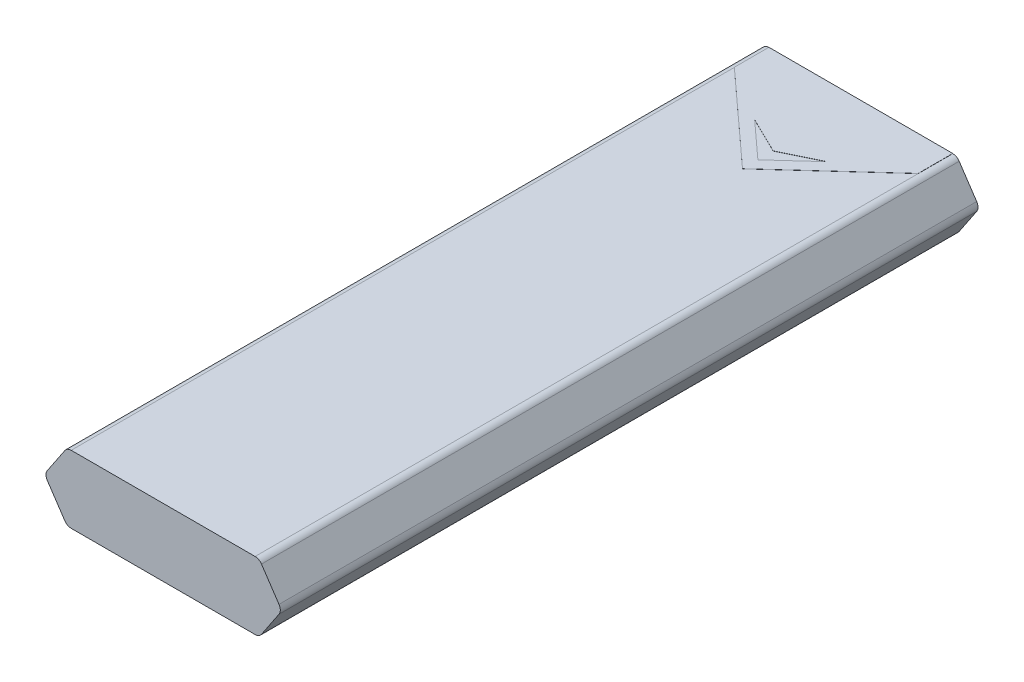
ISO-10303-21;
HEADER;
FILE_DESCRIPTION(('STEP AP214'),'2;1');
FILE_NAME('part.step','',(''),(''),'','','');
FILE_SCHEMA(('AUTOMOTIVE_DESIGN { 1 0 10303 214 1 1 1 1 }'));
ENDSEC;
DATA;
#1=APPLICATION_CONTEXT('core data for automotive mechanical design processes');
#2=APPLICATION_PROTOCOL_DEFINITION('international standard','automotive_design',2000,#1);
#3=PRODUCT_CONTEXT('',#1,'mechanical');
#4=PRODUCT('Part','Part','',(#3));
#5=PRODUCT_RELATED_PRODUCT_CATEGORY('part','',(#4));
#6=PRODUCT_DEFINITION_FORMATION('','',#4);
#7=PRODUCT_DEFINITION_CONTEXT('part definition',#1,'design');
#8=PRODUCT_DEFINITION('design','',#6,#7);
#9=PRODUCT_DEFINITION_SHAPE('','',#8);
#10=(LENGTH_UNIT() NAMED_UNIT(*) SI_UNIT(.MILLI.,.METRE.));
#11=(NAMED_UNIT(*) PLANE_ANGLE_UNIT() SI_UNIT($,.RADIAN.));
#12=(NAMED_UNIT(*) SI_UNIT($,.STERADIAN.) SOLID_ANGLE_UNIT());
#13=UNCERTAINTY_MEASURE_WITH_UNIT(LENGTH_MEASURE(1.E-05),#10,'distance_accuracy_value','');
#14=(GEOMETRIC_REPRESENTATION_CONTEXT(3) GLOBAL_UNCERTAINTY_ASSIGNED_CONTEXT((#13)) GLOBAL_UNIT_ASSIGNED_CONTEXT((#10,
#11,#12)) REPRESENTATION_CONTEXT('',''));
#15=CARTESIAN_POINT('',(0.,0.,0.));
#16=DIRECTION('',(0.,0.,1.));
#17=DIRECTION('',(1.,0.,0.));
#18=AXIS2_PLACEMENT_3D('',#15,#16,#17);
#19=CARTESIAN_POINT('',(0.,5.6134,0.));
#20=DIRECTION('',(0.,-1.,0.));
#21=DIRECTION('',(0.,0.,-1.));
#22=AXIS2_PLACEMENT_3D('',#19,#20,#21);
#23=PLANE('',#22);
#24=DIRECTION('',(-0.739282758629296,0.,0.673395131251673));
#25=VECTOR('',#24,1.);
#26=CARTESIAN_POINT('',(15.1974535495722,5.6134,5.715));
#27=LINE('',#26,#25);
#28=CARTESIAN_POINT('',(15.1974535495722,5.6134,5.715));
#29=VERTEX_POINT('',#28);
#30=CARTESIAN_POINT('',(0.,5.6134,19.558));
#31=VERTEX_POINT('',#30);
#32=EDGE_CURVE('E308',#29,#31,#27,.T.);
#33=ORIENTED_EDGE('',*,*,#32,.F.);
#34=DIRECTION('',(0.,0.,1.));
#35=VECTOR('',#34,1.);
#36=CARTESIAN_POINT('',(15.1974535495722,5.6134,0.));
#37=LINE('',#36,#35);
#38=CARTESIAN_POINT('',(15.1974535495722,5.6134,0.));
#39=VERTEX_POINT('',#38);
#40=EDGE_CURVE('E323',#39,#29,#37,.T.);
#41=ORIENTED_EDGE('',*,*,#40,.F.);
#42=DIRECTION('',(-1.,0.,0.));
#43=VECTOR('',#42,1.);
#44=CARTESIAN_POINT('',(15.1974535495722,5.6134,0.));
#45=LINE('',#44,#43);
#46=CARTESIAN_POINT('',(-15.1974535495722,5.6134,0.));
#47=VERTEX_POINT('',#46);
#48=EDGE_CURVE('E320',#39,#47,#45,.T.);
#49=ORIENTED_EDGE('',*,*,#48,.T.);
#50=DIRECTION('',(0.,0.,1.));
#51=VECTOR('',#50,1.);
#52=CARTESIAN_POINT('',(-15.1974535495722,5.6134,0.));
#53=LINE('',#52,#51);
#54=CARTESIAN_POINT('',(-15.1974535495722,5.6134,5.715));
#55=VERTEX_POINT('',#54);
#56=EDGE_CURVE('E317',#47,#55,#53,.T.);
#57=ORIENTED_EDGE('',*,*,#56,.T.);
#58=DIRECTION('',(-0.739282758629296,0.,-0.673395131251672));
#59=VECTOR('',#58,1.);
#60=CARTESIAN_POINT('',(0.,5.6134,19.558));
#61=LINE('',#60,#59);
#62=EDGE_CURVE('E312',#31,#55,#61,.T.);
#63=ORIENTED_EDGE('',*,*,#62,.F.);
#64=EDGE_LOOP('',(#33,#41,#49,#57,#63));
#65=FACE_BOUND('',#64,.T.);
#66=DIRECTION('',(-0.739282758629296,0.,0.673395131251673));
#67=VECTOR('',#66,1.);
#68=CARTESIAN_POINT('',(6.00952982800082,5.6134,11.5440618078114));
#69=LINE('',#68,#67);
#70=CARTESIAN_POINT('',(6.00952982800082,5.6134,11.5440618078114));
#71=VERTEX_POINT('',#70);
#72=CARTESIAN_POINT('',(0.,5.6134,17.018));
#73=VERTEX_POINT('',#72);
#74=EDGE_CURVE('E61',#71,#73,#69,.T.);
#75=ORIENTED_EDGE('',*,*,#74,.T.);
#76=DIRECTION('',(-0.739282758629297,0.,-0.673395131251672));
#77=VECTOR('',#76,1.);
#78=CARTESIAN_POINT('',(0.,5.6134,17.018));
#79=LINE('',#78,#77);
#80=CARTESIAN_POINT('',(-6.00952982800082,5.6134,11.5440618078114));
#81=VERTEX_POINT('',#80);
#82=EDGE_CURVE('E252',#73,#81,#79,.T.);
#83=ORIENTED_EDGE('',*,*,#82,.T.);
#84=DIRECTION('',(0.898623434488135,0.,0.438720780210773));
#85=VECTOR('',#84,1.);
#86=CARTESIAN_POINT('',(-6.00952982800082,5.6134,11.5440618078114));
#87=LINE('',#86,#85);
#88=CARTESIAN_POINT('',(0.,5.6134,14.478));
#89=VERTEX_POINT('',#88);
#90=EDGE_CURVE('E835',#81,#89,#87,.T.);
#91=ORIENTED_EDGE('',*,*,#90,.T.);
#92=DIRECTION('',(0.898623434488135,0.,-0.438720780210773));
#93=VECTOR('',#92,1.);
#94=CARTESIAN_POINT('',(0.,5.6134,14.478));
#95=LINE('',#94,#93);
#96=EDGE_CURVE('E248',#89,#71,#95,.T.);
#97=ORIENTED_EDGE('',*,*,#96,.T.);
#98=EDGE_LOOP('',(#75,#83,#91,#97));
#99=FACE_BOUND('',#98,.T.);
#100=ADVANCED_FACE('F45',(#65,#99),#23,.F.);
#101=CARTESIAN_POINT('',(-15.875,-5.588,115.316));
#102=DIRECTION('',(0.,1.,0.));
#103=DIRECTION('',(0.,0.,1.));
#104=AXIS2_PLACEMENT_3D('',#101,#102,#103);
#105=PLANE('',#104);
#106=DIRECTION('',(-0.739282758629296,0.,0.673395131251673));
#107=VECTOR('',#106,1.);
#108=CARTESIAN_POINT('',(15.1974535495722,-5.588,5.715));
#109=LINE('',#108,#107);
#110=CARTESIAN_POINT('',(15.1974535495722,-5.588,5.71500000000003));
#111=VERTEX_POINT('',#110);
#112=CARTESIAN_POINT('',(0.,-5.588,19.558));
#113=VERTEX_POINT('',#112);
#114=EDGE_CURVE('E254',#111,#113,#109,.T.);
#115=ORIENTED_EDGE('',*,*,#114,.F.);
#116=DIRECTION('',(0.,0.,-1.));
#117=VECTOR('',#116,1.);
#118=CARTESIAN_POINT('',(15.1974535495722,-5.588,115.316));
#119=LINE('',#118,#117);
#120=CARTESIAN_POINT('',(15.1974535495722,-5.588,115.316));
#121=VERTEX_POINT('',#120);
#122=EDGE_CURVE('E500',#111,#121,#119,.F.);
#123=ORIENTED_EDGE('',*,*,#122,.T.);
#124=DIRECTION('',(1.,0.,0.));
#125=VECTOR('',#124,1.);
#126=CARTESIAN_POINT('',(-15.875,-5.588,115.316));
#127=LINE('',#126,#125);
#128=CARTESIAN_POINT('',(-15.1974535495722,-5.588,115.316));
#129=VERTEX_POINT('',#128);
#130=EDGE_CURVE('E408',#129,#121,#127,.T.);
#131=ORIENTED_EDGE('',*,*,#130,.F.);
#132=DIRECTION('',(0.,0.,-1.));
#133=VECTOR('',#132,1.);
#134=CARTESIAN_POINT('',(-15.1974535495722,-5.588,115.316));
#135=LINE('',#134,#133);
#136=CARTESIAN_POINT('',(-15.1974535495722,-5.588,5.715));
#137=VERTEX_POINT('',#136);
#138=EDGE_CURVE('E497',#129,#137,#135,.T.);
#139=ORIENTED_EDGE('',*,*,#138,.T.);
#140=DIRECTION('',(-0.739282758629296,0.,-0.673395131251672));
#141=VECTOR('',#140,1.);
#142=CARTESIAN_POINT('',(0.,-5.588,19.558));
#143=LINE('',#142,#141);
#144=EDGE_CURVE('E69',#113,#137,#143,.T.);
#145=ORIENTED_EDGE('',*,*,#144,.F.);
#146=EDGE_LOOP('',(#115,#123,#131,#139,#145));
#147=FACE_BOUND('',#146,.T.);
#148=ADVANCED_FACE('F543',(#147),#105,.F.);
#149=CARTESIAN_POINT('',(0.,0.,0.));
#150=DIRECTION('',(0.,0.,1.));
#151=DIRECTION('',(1.,0.,0.));
#152=AXIS2_PLACEMENT_3D('',#149,#150,#151);
#153=PLANE('',#152);
#154=CARTESIAN_POINT('',(-15.1974535495722,4.318,0.));
#155=DIRECTION('',(0.,0.,1.));
#156=DIRECTION('',(1.,0.,0.));
#157=AXIS2_PLACEMENT_3D('',#154,#155,#156);
#158=CIRCLE('',#157,1.27);
#159=CARTESIAN_POINT('',(-16.2523096486468,5.02523306642506,0.));
#160=VERTEX_POINT('',#159);
#161=CARTESIAN_POINT('',(-15.1974535495722,5.588,0.));
#162=VERTEX_POINT('',#161);
#163=EDGE_CURVE('E447',#160,#162,#158,.F.);
#164=ORIENTED_EDGE('',*,*,#163,.T.);
#165=DIRECTION('',(0.,-1.,0.));
#166=VECTOR('',#165,1.);
#167=CARTESIAN_POINT('',(-15.1974535495722,5.6134,0.));
#168=LINE('',#167,#166);
#169=EDGE_CURVE('E345',#47,#162,#168,.T.);
#170=ORIENTED_EDGE('',*,*,#169,.F.);
#171=ORIENTED_EDGE('',*,*,#48,.F.);
#172=DIRECTION('',(0.,-1.,0.));
#173=VECTOR('',#172,1.);
#174=CARTESIAN_POINT('',(15.1974535495722,5.6134,0.));
#175=LINE('',#174,#173);
#176=CARTESIAN_POINT('',(15.1974535495722,5.588,0.));
#177=VERTEX_POINT('',#176);
#178=EDGE_CURVE('E341',#39,#177,#175,.T.);
#179=ORIENTED_EDGE('',*,*,#178,.T.);
#180=CARTESIAN_POINT('',(15.1974535495722,4.318,0.));
#181=DIRECTION('',(0.,0.,1.));
#182=DIRECTION('',(1.,0.,0.));
#183=AXIS2_PLACEMENT_3D('',#180,#181,#182);
#184=CIRCLE('',#183,1.27);
#185=CARTESIAN_POINT('',(16.2523096486468,5.02523306642506,0.));
#186=VERTEX_POINT('',#185);
#187=EDGE_CURVE('E462',#177,#186,#184,.F.);
#188=ORIENTED_EDGE('',*,*,#187,.T.);
#189=DIRECTION('',(-0.55687643025595,0.830595353602095,0.));
#190=VECTOR('',#189,1.);
#191=CARTESIAN_POINT('',(19.6215,0.,0.));
#192=LINE('',#191,#190);
#193=CARTESIAN_POINT('',(19.1473323759196,0.707233066425055,0.));
#194=VERTEX_POINT('',#193);
#195=EDGE_CURVE('E404',#194,#186,#192,.T.);
#196=ORIENTED_EDGE('',*,*,#195,.F.);
#197=CARTESIAN_POINT('',(18.0924762768449,0.,0.));
#198=DIRECTION('',(0.,0.,1.));
#199=DIRECTION('',(1.,0.,0.));
#200=AXIS2_PLACEMENT_3D('',#197,#198,#199);
#201=CIRCLE('',#200,1.27);
#202=CARTESIAN_POINT('',(19.1473323759196,-0.707233066425056,0.));
#203=VERTEX_POINT('',#202);
#204=EDGE_CURVE('E459',#194,#203,#201,.F.);
#205=ORIENTED_EDGE('',*,*,#204,.T.);
#206=DIRECTION('',(0.55687643025595,0.830595353602095,0.));
#207=VECTOR('',#206,1.);
#208=CARTESIAN_POINT('',(15.875,-5.588,0.));
#209=LINE('',#208,#207);
#210=CARTESIAN_POINT('',(16.2523096486468,-5.02523306642506,0.));
#211=VERTEX_POINT('',#210);
#212=EDGE_CURVE('E432',#211,#203,#209,.T.);
#213=ORIENTED_EDGE('',*,*,#212,.F.);
#214=CARTESIAN_POINT('',(15.1974535495722,-4.318,0.));
#215=DIRECTION('',(0.,0.,1.));
#216=DIRECTION('',(1.,0.,0.));
#217=AXIS2_PLACEMENT_3D('',#214,#215,#216);
#218=CIRCLE('',#217,1.27);
#219=CARTESIAN_POINT('',(15.1974535495722,-5.588,0.));
#220=VERTEX_POINT('',#219);
#221=EDGE_CURVE('E456',#211,#220,#218,.F.);
#222=ORIENTED_EDGE('',*,*,#221,.T.);
#223=DIRECTION('',(0.,1.,0.));
#224=VECTOR('',#223,1.);
#225=CARTESIAN_POINT('',(15.1974535495722,-5.6134,0.));
#226=LINE('',#225,#224);
#227=CARTESIAN_POINT('',(15.1974535495722,-5.6134,0.));
#228=VERTEX_POINT('',#227);
#229=EDGE_CURVE('E301',#228,#220,#226,.T.);
#230=ORIENTED_EDGE('',*,*,#229,.F.);
#231=DIRECTION('',(-1.,0.,0.));
#232=VECTOR('',#231,1.);
#233=CARTESIAN_POINT('',(15.1974535495722,-5.6134,0.));
#234=LINE('',#233,#232);
#235=CARTESIAN_POINT('',(-15.1974535495722,-5.6134,0.));
#236=VERTEX_POINT('',#235);
#237=EDGE_CURVE('E273',#228,#236,#234,.T.);
#238=ORIENTED_EDGE('',*,*,#237,.T.);
#239=DIRECTION('',(0.,1.,0.));
#240=VECTOR('',#239,1.);
#241=CARTESIAN_POINT('',(-15.1974535495722,-5.6134,0.));
#242=LINE('',#241,#240);
#243=CARTESIAN_POINT('',(-15.1974535495722,-5.588,0.));
#244=VERTEX_POINT('',#243);
#245=EDGE_CURVE('E297',#236,#244,#242,.T.);
#246=ORIENTED_EDGE('',*,*,#245,.T.);
#247=CARTESIAN_POINT('',(-15.1974535495722,-4.318,0.));
#248=DIRECTION('',(0.,0.,1.));
#249=DIRECTION('',(1.,0.,0.));
#250=AXIS2_PLACEMENT_3D('',#247,#248,#249);
#251=CIRCLE('',#250,1.27);
#252=CARTESIAN_POINT('',(-16.2523096486468,-5.02523306642506,0.));
#253=VERTEX_POINT('',#252);
#254=EDGE_CURVE('E453',#244,#253,#251,.F.);
#255=ORIENTED_EDGE('',*,*,#254,.T.);
#256=DIRECTION('',(0.55687643025595,-0.830595353602095,0.));
#257=VECTOR('',#256,1.);
#258=CARTESIAN_POINT('',(-19.6215,0.,0.));
#259=LINE('',#258,#257);
#260=CARTESIAN_POINT('',(-19.1473323759196,-0.707233066425053,0.));
#261=VERTEX_POINT('',#260);
#262=EDGE_CURVE('E428',#261,#253,#259,.T.);
#263=ORIENTED_EDGE('',*,*,#262,.F.);
#264=CARTESIAN_POINT('',(-18.0924762768449,0.,0.));
#265=DIRECTION('',(0.,0.,1.));
#266=DIRECTION('',(1.,0.,0.));
#267=AXIS2_PLACEMENT_3D('',#264,#265,#266);
#268=CIRCLE('',#267,1.27);
#269=CARTESIAN_POINT('',(-19.1473323759196,0.707233066425055,0.));
#270=VERTEX_POINT('',#269);
#271=EDGE_CURVE('E450',#261,#270,#268,.F.);
#272=ORIENTED_EDGE('',*,*,#271,.T.);
#273=DIRECTION('',(-0.55687643025595,-0.830595353602095,0.));
#274=VECTOR('',#273,1.);
#275=CARTESIAN_POINT('',(-15.875,5.588,0.));
#276=LINE('',#275,#274);
#277=EDGE_CURVE('E395',#160,#270,#276,.T.);
#278=ORIENTED_EDGE('',*,*,#277,.F.);
#279=EDGE_LOOP('',(#164,#170,#171,#179,#188,#196,#205,#213,#222,#230,#238,#246,#255,#263,#272,#278));
#280=FACE_BOUND('',#279,.T.);
#281=DIRECTION('',(-1.,0.,0.));
#282=VECTOR('',#281,1.);
#283=CARTESIAN_POINT('',(2.9337,1.1938,0.));
#284=LINE('',#283,#282);
#285=CARTESIAN_POINT('',(2.9337,1.1938,0.));
#286=VERTEX_POINT('',#285);
#287=CARTESIAN_POINT('',(-2.9337,1.1938,0.));
#288=VERTEX_POINT('',#287);
#289=EDGE_CURVE('E360',#286,#288,#284,.T.);
#290=ORIENTED_EDGE('',*,*,#289,.T.);
#291=CARTESIAN_POINT('',(-2.9337,0.,0.));
#292=DIRECTION('',(0.,0.,1.));
#293=DIRECTION('',(1.,0.,0.));
#294=AXIS2_PLACEMENT_3D('',#291,#292,#293);
#295=CIRCLE('',#294,1.1938);
#296=CARTESIAN_POINT('',(-2.9337,-1.1938,0.));
#297=VERTEX_POINT('',#296);
#298=EDGE_CURVE('E373',#288,#297,#295,.T.);
#299=ORIENTED_EDGE('',*,*,#298,.T.);
#300=DIRECTION('',(-1.,0.,0.));
#301=VECTOR('',#300,1.);
#302=CARTESIAN_POINT('',(2.9337,-1.1938,0.));
#303=LINE('',#302,#301);
#304=CARTESIAN_POINT('',(2.9337,-1.1938,0.));
#305=VERTEX_POINT('',#304);
#306=EDGE_CURVE('E340',#305,#297,#303,.T.);
#307=ORIENTED_EDGE('',*,*,#306,.F.);
#308=CARTESIAN_POINT('',(2.9337,0.,0.));
#309=DIRECTION('',(0.,0.,-1.));
#310=DIRECTION('',(-1.,0.,0.));
#311=AXIS2_PLACEMENT_3D('',#308,#309,#310);
#312=CIRCLE('',#311,1.1938);
#313=EDGE_CURVE('E387',#286,#305,#312,.T.);
#314=ORIENTED_EDGE('',*,*,#313,.F.);
#315=EDGE_LOOP('',(#290,#299,#307,#314));
#316=FACE_BOUND('',#315,.T.);
#317=ADVANCED_FACE('F522',(#280,#316),#153,.F.);
#318=CARTESIAN_POINT('',(2.9337,0.,6.985));
#319=DIRECTION('',(0.,0.,-1.));
#320=DIRECTION('',(-1.,0.,0.));
#321=AXIS2_PLACEMENT_3D('',#318,#319,#320);
#322=CYLINDRICAL_SURFACE('',#321,1.1938);
#323=DIRECTION('',(0.,0.,-1.));
#324=VECTOR('',#323,1.);
#325=CARTESIAN_POINT('',(2.9337,1.1938,6.985));
#326=LINE('',#325,#324);
#327=CARTESIAN_POINT('',(2.9337,1.1938,6.985));
#328=VERTEX_POINT('',#327);
#329=EDGE_CURVE('E369',#328,#286,#326,.T.);
#330=ORIENTED_EDGE('',*,*,#329,.T.);
#331=ORIENTED_EDGE('',*,*,#313,.T.);
#332=DIRECTION('',(0.,0.,-1.));
#333=VECTOR('',#332,1.);
#334=CARTESIAN_POINT('',(2.9337,-1.1938,6.985));
#335=LINE('',#334,#333);
#336=CARTESIAN_POINT('',(2.9337,-1.1938,6.985));
#337=VERTEX_POINT('',#336);
#338=EDGE_CURVE('E363',#337,#305,#335,.T.);
#339=ORIENTED_EDGE('',*,*,#338,.F.);
#340=CARTESIAN_POINT('',(2.9337,0.,6.985));
#341=DIRECTION('',(0.,0.,-1.));
#342=DIRECTION('',(-1.,0.,0.));
#343=AXIS2_PLACEMENT_3D('',#340,#341,#342);
#344=CIRCLE('',#343,1.1938);
#345=EDGE_CURVE('E391',#328,#337,#344,.T.);
#346=ORIENTED_EDGE('',*,*,#345,.F.);
#347=EDGE_LOOP('',(#330,#331,#339,#346));
#348=FACE_BOUND('',#347,.T.);
#349=ADVANCED_FACE('F644',(#348),#322,.F.);
#350=CARTESIAN_POINT('',(-2.9337,0.,6.985));
#351=DIRECTION('',(0.,0.,-1.));
#352=DIRECTION('',(-1.,0.,0.));
#353=AXIS2_PLACEMENT_3D('',#350,#351,#352);
#354=CYLINDRICAL_SURFACE('',#353,1.1938);
#355=ORIENTED_EDGE('',*,*,#298,.F.);
#356=DIRECTION('',(0.,0.,-1.));
#357=VECTOR('',#356,1.);
#358=CARTESIAN_POINT('',(-2.9337,1.1938,6.985));
#359=LINE('',#358,#357);
#360=CARTESIAN_POINT('',(-2.9337,1.1938,6.985));
#361=VERTEX_POINT('',#360);
#362=EDGE_CURVE('E374',#361,#288,#359,.T.);
#363=ORIENTED_EDGE('',*,*,#362,.F.);
#364=CARTESIAN_POINT('',(-2.9337,0.,6.985));
#365=DIRECTION('',(0.,0.,1.));
#366=DIRECTION('',(1.,0.,0.));
#367=AXIS2_PLACEMENT_3D('',#364,#365,#366);
#368=CIRCLE('',#367,1.1938);
#369=CARTESIAN_POINT('',(-2.9337,-1.1938,6.985));
#370=VERTEX_POINT('',#369);
#371=EDGE_CURVE('E383',#361,#370,#368,.T.);
#372=ORIENTED_EDGE('',*,*,#371,.T.);
#373=DIRECTION('',(0.,0.,-1.));
#374=VECTOR('',#373,1.);
#375=CARTESIAN_POINT('',(-2.9337,-1.1938,6.985));
#376=LINE('',#375,#374);
#377=EDGE_CURVE('E377',#370,#297,#376,.T.);
#378=ORIENTED_EDGE('',*,*,#377,.T.);
#379=EDGE_LOOP('',(#355,#363,#372,#378));
#380=FACE_BOUND('',#379,.T.);
#381=ADVANCED_FACE('F641',(#380),#354,.F.);
#382=CARTESIAN_POINT('',(-15.875,5.588,115.316));
#383=DIRECTION('',(0.830595353602095,-0.55687643025595,0.));
#384=DIRECTION('',(0.55687643025595,0.830595353602095,0.));
#385=AXIS2_PLACEMENT_3D('',#382,#383,#384);
#386=PLANE('',#385);
#387=ORIENTED_EDGE('',*,*,#277,.T.);
#388=DIRECTION('',(0.,0.,-1.));
#389=VECTOR('',#388,1.);
#390=CARTESIAN_POINT('',(-19.1473323759196,0.707233066425057,115.316));
#391=LINE('',#390,#389);
#392=CARTESIAN_POINT('',(-19.1473323759196,0.707233066425055,115.316));
#393=VERTEX_POINT('',#392);
#394=EDGE_CURVE('E11',#270,#393,#391,.F.);
#395=ORIENTED_EDGE('',*,*,#394,.T.);
#396=DIRECTION('',(-0.55687643025595,-0.830595353602095,0.));
#397=VECTOR('',#396,1.);
#398=CARTESIAN_POINT('',(-15.875,5.588,115.316));
#399=LINE('',#398,#397);
#400=CARTESIAN_POINT('',(-16.2523096486468,5.02523306642506,115.316));
#401=VERTEX_POINT('',#400);
#402=EDGE_CURVE('E399',#401,#393,#399,.T.);
#403=ORIENTED_EDGE('',*,*,#402,.F.);
#404=DIRECTION('',(0.,0.,-1.));
#405=VECTOR('',#404,1.);
#406=CARTESIAN_POINT('',(-16.2523096486468,5.02523306642506,0.));
#407=LINE('',#406,#405);
#408=EDGE_CURVE('E54',#401,#160,#407,.T.);
#409=ORIENTED_EDGE('',*,*,#408,.T.);
#410=EDGE_LOOP('',(#387,#395,#403,#409));
#411=FACE_BOUND('',#410,.T.);
#412=ADVANCED_FACE('F517',(#411),#386,.F.);
#413=CARTESIAN_POINT('',(-19.6215,0.,115.316));
#414=DIRECTION('',(0.830595353602095,0.55687643025595,0.));
#415=DIRECTION('',(-0.55687643025595,0.830595353602096,0.));
#416=AXIS2_PLACEMENT_3D('',#413,#414,#415);
#417=PLANE('',#416);
#418=ORIENTED_EDGE('',*,*,#262,.T.);
#419=DIRECTION('',(0.,0.,-1.));
#420=VECTOR('',#419,1.);
#421=CARTESIAN_POINT('',(-16.2523096486468,-5.02523306642506,115.316));
#422=LINE('',#421,#420);
#423=CARTESIAN_POINT('',(-16.2523096486468,-5.02523306642506,115.316));
#424=VERTEX_POINT('',#423);
#425=EDGE_CURVE('E509',#253,#424,#422,.F.);
#426=ORIENTED_EDGE('',*,*,#425,.T.);
#427=DIRECTION('',(0.55687643025595,-0.830595353602095,0.));
#428=VECTOR('',#427,1.);
#429=CARTESIAN_POINT('',(-19.6215,0.,115.316));
#430=LINE('',#429,#428);
#431=CARTESIAN_POINT('',(-19.1473323759196,-0.707233066425053,115.316));
#432=VERTEX_POINT('',#431);
#433=EDGE_CURVE('E403',#432,#424,#430,.T.);
#434=ORIENTED_EDGE('',*,*,#433,.F.);
#435=DIRECTION('',(0.,0.,-1.));
#436=VECTOR('',#435,1.);
#437=CARTESIAN_POINT('',(-19.1473323759196,-0.707233066425054,115.316));
#438=LINE('',#437,#436);
#439=EDGE_CURVE('E505',#432,#261,#438,.T.);
#440=ORIENTED_EDGE('',*,*,#439,.T.);
#441=EDGE_LOOP('',(#418,#426,#434,#440));
#442=FACE_BOUND('',#441,.T.);
#443=ADVANCED_FACE('F533',(#442),#417,.F.);
#444=CARTESIAN_POINT('',(15.875,-5.588,115.316));
#445=DIRECTION('',(-0.830595353602095,0.55687643025595,0.));
#446=DIRECTION('',(-0.55687643025595,-0.830595353602095,0.));
#447=AXIS2_PLACEMENT_3D('',#444,#445,#446);
#448=PLANE('',#447);
#449=ORIENTED_EDGE('',*,*,#212,.T.);
#450=DIRECTION('',(0.,0.,-1.));
#451=VECTOR('',#450,1.);
#452=CARTESIAN_POINT('',(19.1473323759196,-0.707233066425056,115.316));
#453=LINE('',#452,#451);
#454=CARTESIAN_POINT('',(19.1473323759196,-0.707233066425056,115.316));
#455=VERTEX_POINT('',#454);
#456=EDGE_CURVE('E494',#203,#455,#453,.F.);
#457=ORIENTED_EDGE('',*,*,#456,.T.);
#458=DIRECTION('',(0.55687643025595,0.830595353602095,0.));
#459=VECTOR('',#458,1.);
#460=CARTESIAN_POINT('',(15.875,-5.588,115.316));
#461=LINE('',#460,#459);
#462=CARTESIAN_POINT('',(16.2523096486468,-5.02523306642506,115.316));
#463=VERTEX_POINT('',#462);
#464=EDGE_CURVE('E412',#463,#455,#461,.T.);
#465=ORIENTED_EDGE('',*,*,#464,.F.);
#466=DIRECTION('',(0.,0.,-1.));
#467=VECTOR('',#466,1.);
#468=CARTESIAN_POINT('',(16.2523096486468,-5.02523306642506,115.316));
#469=LINE('',#468,#467);
#470=EDGE_CURVE('E490',#463,#211,#469,.T.);
#471=ORIENTED_EDGE('',*,*,#470,.T.);
#472=EDGE_LOOP('',(#449,#457,#465,#471));
#473=FACE_BOUND('',#472,.T.);
#474=ADVANCED_FACE('F569',(#473),#448,.F.);
#475=CARTESIAN_POINT('',(19.6215,0.,115.316));
#476=DIRECTION('',(-0.830595353602095,-0.55687643025595,0.));
#477=DIRECTION('',(0.55687643025595,-0.830595353602095,0.));
#478=AXIS2_PLACEMENT_3D('',#475,#476,#477);
#479=PLANE('',#478);
#480=ORIENTED_EDGE('',*,*,#195,.T.);
#481=DIRECTION('',(0.,0.,-1.));
#482=VECTOR('',#481,1.);
#483=CARTESIAN_POINT('',(16.2523096486468,5.02523306642506,115.316));
#484=LINE('',#483,#482);
#485=CARTESIAN_POINT('',(16.2523096486468,5.02523306642506,115.316));
#486=VERTEX_POINT('',#485);
#487=EDGE_CURVE('E469',#186,#486,#484,.F.);
#488=ORIENTED_EDGE('',*,*,#487,.T.);
#489=DIRECTION('',(-0.55687643025595,0.830595353602095,0.));
#490=VECTOR('',#489,1.);
#491=CARTESIAN_POINT('',(19.6215,0.,115.316));
#492=LINE('',#491,#490);
#493=CARTESIAN_POINT('',(19.1473323759196,0.707233066425055,115.316));
#494=VERTEX_POINT('',#493);
#495=EDGE_CURVE('E416',#494,#486,#492,.T.);
#496=ORIENTED_EDGE('',*,*,#495,.F.);
#497=DIRECTION('',(0.,0.,-1.));
#498=VECTOR('',#497,1.);
#499=CARTESIAN_POINT('',(19.1473323759196,0.707233066425055,115.316));
#500=LINE('',#499,#498);
#501=EDGE_CURVE('E465',#494,#194,#500,.T.);
#502=ORIENTED_EDGE('',*,*,#501,.T.);
#503=EDGE_LOOP('',(#480,#488,#496,#502));
#504=FACE_BOUND('',#503,.T.);
#505=ADVANCED_FACE('F578',(#504),#479,.F.);
#506=CARTESIAN_POINT('',(-15.875,5.588,115.316));
#507=DIRECTION('',(0.,1.,0.));
#508=DIRECTION('',(0.,0.,1.));
#509=AXIS2_PLACEMENT_3D('',#506,#507,#508);
#510=PLANE('',#509);
#511=DIRECTION('',(-0.739282758629296,0.,0.673395131251673));
#512=VECTOR('',#511,1.);
#513=CARTESIAN_POINT('',(15.1974535495722,5.588,5.715));
#514=LINE('',#513,#512);
#515=CARTESIAN_POINT('',(15.1974535495722,5.588,5.715));
#516=VERTEX_POINT('',#515);
#517=CARTESIAN_POINT('',(0.,5.588,19.558));
#518=VERTEX_POINT('',#517);
#519=EDGE_CURVE('E292',#516,#518,#514,.T.);
#520=ORIENTED_EDGE('',*,*,#519,.T.);
#521=DIRECTION('',(-0.739282758629296,0.,-0.673395131251672));
#522=VECTOR('',#521,1.);
#523=CARTESIAN_POINT('',(0.,5.588,19.558));
#524=LINE('',#523,#522);
#525=CARTESIAN_POINT('',(-15.1974535495722,5.588,5.715));
#526=VERTEX_POINT('',#525);
#527=EDGE_CURVE('E330',#518,#526,#524,.T.);
#528=ORIENTED_EDGE('',*,*,#527,.T.);
#529=DIRECTION('',(0.,0.,-1.));
#530=VECTOR('',#529,1.);
#531=CARTESIAN_POINT('',(-15.1974535495722,5.588,115.316));
#532=LINE('',#531,#530);
#533=CARTESIAN_POINT('',(-15.1974535495722,5.588,115.316));
#534=VERTEX_POINT('',#533);
#535=EDGE_CURVE('E424',#526,#534,#532,.F.);
#536=ORIENTED_EDGE('',*,*,#535,.T.);
#537=DIRECTION('',(1.,0.,0.));
#538=VECTOR('',#537,1.);
#539=CARTESIAN_POINT('',(-15.875,5.588,115.316));
#540=LINE('',#539,#538);
#541=CARTESIAN_POINT('',(15.1974535495722,5.588,115.316));
#542=VERTEX_POINT('',#541);
#543=EDGE_CURVE('E420',#534,#542,#540,.T.);
#544=ORIENTED_EDGE('',*,*,#543,.T.);
#545=DIRECTION('',(0.,0.,-1.));
#546=VECTOR('',#545,1.);
#547=CARTESIAN_POINT('',(15.1974535495722,5.588,0.));
#548=LINE('',#547,#546);
#549=EDGE_CURVE('E443',#542,#516,#548,.T.);
#550=ORIENTED_EDGE('',*,*,#549,.T.);
#551=EDGE_LOOP('',(#520,#528,#536,#544,#550));
#552=FACE_BOUND('',#551,.T.);
#553=ADVANCED_FACE('F588',(#552),#510,.T.);
#554=CARTESIAN_POINT('',(0.,0.,115.316));
#555=DIRECTION('',(0.,0.,1.));
#556=DIRECTION('',(1.,0.,0.));
#557=AXIS2_PLACEMENT_3D('',#554,#555,#556);
#558=PLANE('',#557);
#559=ORIENTED_EDGE('',*,*,#495,.T.);
#560=CARTESIAN_POINT('',(15.1974535495722,4.318,115.316));
#561=DIRECTION('',(0.,0.,1.));
#562=DIRECTION('',(1.,0.,0.));
#563=AXIS2_PLACEMENT_3D('',#560,#561,#562);
#564=CIRCLE('',#563,1.27);
#565=EDGE_CURVE('E487',#486,#542,#564,.T.);
#566=ORIENTED_EDGE('',*,*,#565,.T.);
#567=ORIENTED_EDGE('',*,*,#543,.F.);
#568=CARTESIAN_POINT('',(-15.1974535495722,4.318,115.316));
#569=DIRECTION('',(0.,0.,1.));
#570=DIRECTION('',(1.,0.,0.));
#571=AXIS2_PLACEMENT_3D('',#568,#569,#570);
#572=CIRCLE('',#571,1.27);
#573=EDGE_CURVE('E472',#534,#401,#572,.T.);
#574=ORIENTED_EDGE('',*,*,#573,.T.);
#575=ORIENTED_EDGE('',*,*,#402,.T.);
#576=CARTESIAN_POINT('',(-18.0924762768449,0.,115.316));
#577=DIRECTION('',(0.,0.,1.));
#578=DIRECTION('',(1.,0.,0.));
#579=AXIS2_PLACEMENT_3D('',#576,#577,#578);
#580=CIRCLE('',#579,1.27);
#581=EDGE_CURVE('E475',#393,#432,#580,.T.);
#582=ORIENTED_EDGE('',*,*,#581,.T.);
#583=ORIENTED_EDGE('',*,*,#433,.T.);
#584=CARTESIAN_POINT('',(-15.1974535495722,-4.318,115.316));
#585=DIRECTION('',(0.,0.,1.));
#586=DIRECTION('',(1.,0.,0.));
#587=AXIS2_PLACEMENT_3D('',#584,#585,#586);
#588=CIRCLE('',#587,1.27);
#589=EDGE_CURVE('E478',#424,#129,#588,.T.);
#590=ORIENTED_EDGE('',*,*,#589,.T.);
#591=ORIENTED_EDGE('',*,*,#130,.T.);
#592=CARTESIAN_POINT('',(15.1974535495722,-4.318,115.316));
#593=DIRECTION('',(0.,0.,1.));
#594=DIRECTION('',(1.,0.,0.));
#595=AXIS2_PLACEMENT_3D('',#592,#593,#594);
#596=CIRCLE('',#595,1.27);
#597=EDGE_CURVE('E481',#121,#463,#596,.T.);
#598=ORIENTED_EDGE('',*,*,#597,.T.);
#599=ORIENTED_EDGE('',*,*,#464,.T.);
#600=CARTESIAN_POINT('',(18.0924762768449,0.,115.316));
#601=DIRECTION('',(0.,0.,1.));
#602=DIRECTION('',(1.,0.,0.));
#603=AXIS2_PLACEMENT_3D('',#600,#601,#602);
#604=CIRCLE('',#603,1.27);
#605=EDGE_CURVE('E484',#455,#494,#604,.T.);
#606=ORIENTED_EDGE('',*,*,#605,.T.);
#607=EDGE_LOOP('',(#559,#566,#567,#574,#575,#582,#583,#590,#591,#598,#599,#606));
#608=FACE_BOUND('',#607,.T.);
#609=ADVANCED_FACE('F537',(#608),#558,.T.);
#610=CARTESIAN_POINT('',(2.9337,0.,6.985));
#611=DIRECTION('',(0.,0.,-1.));
#612=DIRECTION('',(-1.,0.,0.));
#613=AXIS2_PLACEMENT_3D('',#610,#611,#612);
#614=PLANE('',#613);
#615=ORIENTED_EDGE('',*,*,#345,.T.);
#616=DIRECTION('',(-1.,0.,0.));
#617=VECTOR('',#616,1.);
#618=CARTESIAN_POINT('',(2.9337,-1.1938,6.985));
#619=LINE('',#618,#617);
#620=EDGE_CURVE('E356',#337,#370,#619,.T.);
#621=ORIENTED_EDGE('',*,*,#620,.T.);
#622=ORIENTED_EDGE('',*,*,#371,.F.);
#623=DIRECTION('',(-1.,0.,0.));
#624=VECTOR('',#623,1.);
#625=CARTESIAN_POINT('',(2.9337,1.1938,6.985));
#626=LINE('',#625,#624);
#627=EDGE_CURVE('E359',#328,#361,#626,.T.);
#628=ORIENTED_EDGE('',*,*,#627,.F.);
#629=EDGE_LOOP('',(#615,#621,#622,#628));
#630=FACE_BOUND('',#629,.T.);
#631=ADVANCED_FACE('F636',(#630),#614,.T.);
#632=CARTESIAN_POINT('',(2.9337,1.1938,6.985));
#633=DIRECTION('',(0.,-1.,0.));
#634=DIRECTION('',(0.,0.,-1.));
#635=AXIS2_PLACEMENT_3D('',#632,#633,#634);
#636=PLANE('',#635);
#637=ORIENTED_EDGE('',*,*,#289,.F.);
#638=ORIENTED_EDGE('',*,*,#329,.F.);
#639=ORIENTED_EDGE('',*,*,#627,.T.);
#640=ORIENTED_EDGE('',*,*,#362,.T.);
#641=EDGE_LOOP('',(#637,#638,#639,#640));
#642=FACE_BOUND('',#641,.T.);
#643=ADVANCED_FACE('F632',(#642),#636,.T.);
#644=CARTESIAN_POINT('',(2.9337,-1.1938,6.985));
#645=DIRECTION('',(0.,-1.,0.));
#646=DIRECTION('',(0.,0.,-1.));
#647=AXIS2_PLACEMENT_3D('',#644,#645,#646);
#648=PLANE('',#647);
#649=ORIENTED_EDGE('',*,*,#306,.T.);
#650=ORIENTED_EDGE('',*,*,#377,.F.);
#651=ORIENTED_EDGE('',*,*,#620,.F.);
#652=ORIENTED_EDGE('',*,*,#338,.T.);
#653=EDGE_LOOP('',(#649,#650,#651,#652));
#654=FACE_BOUND('',#653,.T.);
#655=ADVANCED_FACE('F635',(#654),#648,.F.);
#656=CARTESIAN_POINT('',(15.1974535495722,4.318,115.316));
#657=DIRECTION('',(0.,0.,1.));
#658=DIRECTION('',(1.,0.,0.));
#659=AXIS2_PLACEMENT_3D('',#656,#657,#658);
#660=CYLINDRICAL_SURFACE('',#659,1.27);
#661=ORIENTED_EDGE('',*,*,#565,.F.);
#662=ORIENTED_EDGE('',*,*,#487,.F.);
#663=ORIENTED_EDGE('',*,*,#187,.F.);
#664=DIRECTION('',(0.,0.,1.));
#665=VECTOR('',#664,1.);
#666=CARTESIAN_POINT('',(15.1974535495722,5.588,0.));
#667=LINE('',#666,#665);
#668=EDGE_CURVE('E313',#177,#516,#667,.T.);
#669=ORIENTED_EDGE('',*,*,#668,.T.);
#670=ORIENTED_EDGE('',*,*,#549,.F.);
#671=EDGE_LOOP('',(#661,#662,#663,#669,#670));
#672=FACE_BOUND('',#671,.T.);
#673=ADVANCED_FACE('F584',(#672),#660,.T.);
#674=CARTESIAN_POINT('',(18.0924762768449,0.,115.316));
#675=DIRECTION('',(0.,0.,-1.));
#676=DIRECTION('',(-1.,0.,0.));
#677=AXIS2_PLACEMENT_3D('',#674,#675,#676);
#678=CYLINDRICAL_SURFACE('',#677,1.27);
#679=ORIENTED_EDGE('',*,*,#605,.F.);
#680=ORIENTED_EDGE('',*,*,#456,.F.);
#681=ORIENTED_EDGE('',*,*,#204,.F.);
#682=ORIENTED_EDGE('',*,*,#501,.F.);
#683=EDGE_LOOP('',(#679,#680,#681,#682));
#684=FACE_BOUND('',#683,.T.);
#685=ADVANCED_FACE('F575',(#684),#678,.T.);
#686=CARTESIAN_POINT('',(15.1974535495722,-4.318,115.316));
#687=DIRECTION('',(0.,0.,-1.));
#688=DIRECTION('',(-1.,0.,0.));
#689=AXIS2_PLACEMENT_3D('',#686,#687,#688);
#690=CYLINDRICAL_SURFACE('',#689,1.27);
#691=ORIENTED_EDGE('',*,*,#597,.F.);
#692=ORIENTED_EDGE('',*,*,#122,.F.);
#693=EDGE_CURVE('E501',#220,#111,#119,.F.);
#694=ORIENTED_EDGE('',*,*,#693,.F.);
#695=ORIENTED_EDGE('',*,*,#221,.F.);
#696=ORIENTED_EDGE('',*,*,#470,.F.);
#697=EDGE_LOOP('',(#691,#692,#694,#695,#696));
#698=FACE_BOUND('',#697,.T.);
#699=ADVANCED_FACE('F559',(#698),#690,.T.);
#700=CARTESIAN_POINT('',(-15.1974535495722,-4.318,115.316));
#701=DIRECTION('',(0.,0.,-1.));
#702=DIRECTION('',(-1.,0.,0.));
#703=AXIS2_PLACEMENT_3D('',#700,#701,#702);
#704=CYLINDRICAL_SURFACE('',#703,1.27);
#705=ORIENTED_EDGE('',*,*,#589,.F.);
#706=ORIENTED_EDGE('',*,*,#425,.F.);
#707=ORIENTED_EDGE('',*,*,#254,.F.);
#708=DIRECTION('',(0.,0.,1.));
#709=VECTOR('',#708,1.);
#710=CARTESIAN_POINT('',(-15.1974535495722,-5.588,0.));
#711=LINE('',#710,#709);
#712=EDGE_CURVE('E260',#244,#137,#711,.T.);
#713=ORIENTED_EDGE('',*,*,#712,.T.);
#714=ORIENTED_EDGE('',*,*,#138,.F.);
#715=EDGE_LOOP('',(#705,#706,#707,#713,#714));
#716=FACE_BOUND('',#715,.T.);
#717=ADVANCED_FACE('F541',(#716),#704,.T.);
#718=CARTESIAN_POINT('',(-18.0924762768449,0.,115.316));
#719=DIRECTION('',(0.,0.,-1.));
#720=DIRECTION('',(-1.,0.,0.));
#721=AXIS2_PLACEMENT_3D('',#718,#719,#720);
#722=CYLINDRICAL_SURFACE('',#721,1.27);
#723=ORIENTED_EDGE('',*,*,#581,.F.);
#724=ORIENTED_EDGE('',*,*,#394,.F.);
#725=ORIENTED_EDGE('',*,*,#271,.F.);
#726=ORIENTED_EDGE('',*,*,#439,.F.);
#727=EDGE_LOOP('',(#723,#724,#725,#726));
#728=FACE_BOUND('',#727,.T.);
#729=ADVANCED_FACE('F530',(#728),#722,.T.);
#730=CARTESIAN_POINT('',(-15.1974535495722,4.318,115.316));
#731=DIRECTION('',(0.,0.,1.));
#732=DIRECTION('',(1.,0.,0.));
#733=AXIS2_PLACEMENT_3D('',#730,#731,#732);
#734=CYLINDRICAL_SURFACE('',#733,1.27);
#735=ORIENTED_EDGE('',*,*,#573,.F.);
#736=ORIENTED_EDGE('',*,*,#535,.F.);
#737=EDGE_CURVE('E439',#162,#526,#532,.F.);
#738=ORIENTED_EDGE('',*,*,#737,.F.);
#739=ORIENTED_EDGE('',*,*,#163,.F.);
#740=ORIENTED_EDGE('',*,*,#408,.F.);
#741=EDGE_LOOP('',(#735,#736,#738,#739,#740));
#742=FACE_BOUND('',#741,.T.);
#743=ADVANCED_FACE('F47',(#742),#734,.T.);
#744=CARTESIAN_POINT('',(15.1974535495722,5.6134,5.715));
#745=DIRECTION('',(0.673395131251673,0.,0.739282758629296));
#746=DIRECTION('',(0.739282758629296,0.,-0.673395131251673));
#747=AXIS2_PLACEMENT_3D('',#744,#745,#746);
#748=PLANE('',#747);
#749=ORIENTED_EDGE('',*,*,#519,.F.);
#750=DIRECTION('',(0.,-1.,0.));
#751=VECTOR('',#750,1.);
#752=CARTESIAN_POINT('',(15.1974535495722,5.6134,5.715));
#753=LINE('',#752,#751);
#754=EDGE_CURVE('E336',#29,#516,#753,.T.);
#755=ORIENTED_EDGE('',*,*,#754,.F.);
#756=ORIENTED_EDGE('',*,*,#32,.T.);
#757=DIRECTION('',(0.,-1.,0.));
#758=VECTOR('',#757,1.);
#759=CARTESIAN_POINT('',(0.,5.6134,19.558));
#760=LINE('',#759,#758);
#761=EDGE_CURVE('E327',#31,#518,#760,.T.);
#762=ORIENTED_EDGE('',*,*,#761,.T.);
#763=EDGE_LOOP('',(#749,#755,#756,#762));
#764=FACE_BOUND('',#763,.T.);
#765=ADVANCED_FACE('F604',(#764),#748,.T.);
#766=CARTESIAN_POINT('',(15.1974535495722,5.6134,0.));
#767=DIRECTION('',(1.,0.,0.));
#768=DIRECTION('',(0.,0.,-1.));
#769=AXIS2_PLACEMENT_3D('',#766,#767,#768);
#770=PLANE('',#769);
#771=ORIENTED_EDGE('',*,*,#668,.F.);
#772=ORIENTED_EDGE('',*,*,#178,.F.);
#773=ORIENTED_EDGE('',*,*,#40,.T.);
#774=ORIENTED_EDGE('',*,*,#754,.T.);
#775=EDGE_LOOP('',(#771,#772,#773,#774));
#776=FACE_BOUND('',#775,.T.);
#777=ADVANCED_FACE('F601',(#776),#770,.T.);
#778=CARTESIAN_POINT('',(-15.1974535495722,5.6134,0.));
#779=DIRECTION('',(1.,0.,0.));
#780=DIRECTION('',(0.,0.,-1.));
#781=AXIS2_PLACEMENT_3D('',#778,#779,#780);
#782=PLANE('',#781);
#783=ORIENTED_EDGE('',*,*,#737,.T.);
#784=DIRECTION('',(0.,-1.,0.));
#785=VECTOR('',#784,1.);
#786=CARTESIAN_POINT('',(-15.1974535495722,5.6134,5.715));
#787=LINE('',#786,#785);
#788=EDGE_CURVE('E349',#55,#526,#787,.T.);
#789=ORIENTED_EDGE('',*,*,#788,.F.);
#790=ORIENTED_EDGE('',*,*,#56,.F.);
#791=ORIENTED_EDGE('',*,*,#169,.T.);
#792=EDGE_LOOP('',(#783,#789,#790,#791));
#793=FACE_BOUND('',#792,.T.);
#794=ADVANCED_FACE('F594',(#793),#782,.F.);
#795=CARTESIAN_POINT('',(0.,5.6134,19.558));
#796=DIRECTION('',(-0.673395131251672,0.,0.739282758629297));
#797=DIRECTION('',(0.739282758629297,0.,0.673395131251672));
#798=AXIS2_PLACEMENT_3D('',#795,#796,#797);
#799=PLANE('',#798);
#800=ORIENTED_EDGE('',*,*,#527,.F.);
#801=ORIENTED_EDGE('',*,*,#761,.F.);
#802=ORIENTED_EDGE('',*,*,#62,.T.);
#803=ORIENTED_EDGE('',*,*,#788,.T.);
#804=EDGE_LOOP('',(#800,#801,#802,#803));
#805=FACE_BOUND('',#804,.T.);
#806=ADVANCED_FACE('F606',(#805),#799,.T.);
#807=CARTESIAN_POINT('',(15.1974535495722,-5.6134,5.715));
#808=DIRECTION('',(-0.673395131251673,0.,-0.739282758629296));
#809=DIRECTION('',(-0.739282758629296,0.,0.673395131251673));
#810=AXIS2_PLACEMENT_3D('',#807,#808,#809);
#811=PLANE('',#810);
#812=ORIENTED_EDGE('',*,*,#114,.T.);
#813=DIRECTION('',(0.,1.,0.));
#814=VECTOR('',#813,1.);
#815=CARTESIAN_POINT('',(0.,-5.6134,19.558));
#816=LINE('',#815,#814);
#817=CARTESIAN_POINT('',(0.,-5.6134,19.558));
#818=VERTEX_POINT('',#817);
#819=EDGE_CURVE('E289',#818,#113,#816,.T.);
#820=ORIENTED_EDGE('',*,*,#819,.F.);
#821=DIRECTION('',(-0.739282758629296,0.,0.673395131251673));
#822=VECTOR('',#821,1.);
#823=CARTESIAN_POINT('',(15.1974535495722,-5.6134,5.715));
#824=LINE('',#823,#822);
#825=CARTESIAN_POINT('',(15.1974535495722,-5.6134,5.715));
#826=VERTEX_POINT('',#825);
#827=EDGE_CURVE('E266',#826,#818,#824,.T.);
#828=ORIENTED_EDGE('',*,*,#827,.F.);
#829=DIRECTION('',(0.,1.,0.));
#830=VECTOR('',#829,1.);
#831=CARTESIAN_POINT('',(15.1974535495722,-5.6134,5.715));
#832=LINE('',#831,#830);
#833=EDGE_CURVE('E283',#826,#111,#832,.T.);
#834=ORIENTED_EDGE('',*,*,#833,.T.);
#835=EDGE_LOOP('',(#812,#820,#828,#834));
#836=FACE_BOUND('',#835,.T.);
#837=ADVANCED_FACE('F553',(#836),#811,.F.);
#838=CARTESIAN_POINT('',(0.,-5.6134,19.558));
#839=DIRECTION('',(0.673395131251672,0.,-0.739282758629297));
#840=DIRECTION('',(-0.739282758629297,0.,-0.673395131251672));
#841=AXIS2_PLACEMENT_3D('',#838,#839,#840);
#842=PLANE('',#841);
#843=ORIENTED_EDGE('',*,*,#144,.T.);
#844=DIRECTION('',(0.,1.,0.));
#845=VECTOR('',#844,1.);
#846=CARTESIAN_POINT('',(-15.1974535495722,-5.6134,5.715));
#847=LINE('',#846,#845);
#848=CARTESIAN_POINT('',(-15.1974535495722,-5.6134,5.715));
#849=VERTEX_POINT('',#848);
#850=EDGE_CURVE('E293',#849,#137,#847,.T.);
#851=ORIENTED_EDGE('',*,*,#850,.F.);
#852=DIRECTION('',(-0.739282758629296,0.,-0.673395131251672));
#853=VECTOR('',#852,1.);
#854=CARTESIAN_POINT('',(0.,-5.6134,19.558));
#855=LINE('',#854,#853);
#856=EDGE_CURVE('E281',#818,#849,#855,.T.);
#857=ORIENTED_EDGE('',*,*,#856,.F.);
#858=ORIENTED_EDGE('',*,*,#819,.T.);
#859=EDGE_LOOP('',(#843,#851,#857,#858));
#860=FACE_BOUND('',#859,.T.);
#861=ADVANCED_FACE('F549',(#860),#842,.F.);
#862=CARTESIAN_POINT('',(-15.1974535495722,-5.6134,0.));
#863=DIRECTION('',(-1.,0.,0.));
#864=DIRECTION('',(0.,0.,1.));
#865=AXIS2_PLACEMENT_3D('',#862,#863,#864);
#866=PLANE('',#865);
#867=ORIENTED_EDGE('',*,*,#712,.F.);
#868=ORIENTED_EDGE('',*,*,#245,.F.);
#869=DIRECTION('',(0.,0.,1.));
#870=VECTOR('',#869,1.);
#871=CARTESIAN_POINT('',(-15.1974535495722,-5.6134,0.));
#872=LINE('',#871,#870);
#873=EDGE_CURVE('E277',#236,#849,#872,.T.);
#874=ORIENTED_EDGE('',*,*,#873,.T.);
#875=ORIENTED_EDGE('',*,*,#850,.T.);
#876=EDGE_LOOP('',(#867,#868,#874,#875));
#877=FACE_BOUND('',#876,.T.);
#878=ADVANCED_FACE('F546',(#877),#866,.T.);
#879=CARTESIAN_POINT('',(15.1974535495722,-5.6134,0.));
#880=DIRECTION('',(-1.,0.,0.));
#881=DIRECTION('',(0.,0.,1.));
#882=AXIS2_PLACEMENT_3D('',#879,#880,#881);
#883=PLANE('',#882);
#884=ORIENTED_EDGE('',*,*,#693,.T.);
#885=ORIENTED_EDGE('',*,*,#833,.F.);
#886=DIRECTION('',(0.,0.,1.));
#887=VECTOR('',#886,1.);
#888=CARTESIAN_POINT('',(15.1974535495722,-5.6134,0.));
#889=LINE('',#888,#887);
#890=EDGE_CURVE('E270',#228,#826,#889,.T.);
#891=ORIENTED_EDGE('',*,*,#890,.F.);
#892=ORIENTED_EDGE('',*,*,#229,.T.);
#893=EDGE_LOOP('',(#884,#885,#891,#892));
#894=FACE_BOUND('',#893,.T.);
#895=ADVANCED_FACE('F563',(#894),#883,.F.);
#896=CARTESIAN_POINT('',(0.,-5.6134,0.));
#897=DIRECTION('',(0.,1.,0.));
#898=DIRECTION('',(0.,0.,-1.));
#899=AXIS2_PLACEMENT_3D('',#896,#897,#898);
#900=PLANE('',#899);
#901=ORIENTED_EDGE('',*,*,#827,.T.);
#902=ORIENTED_EDGE('',*,*,#856,.T.);
#903=ORIENTED_EDGE('',*,*,#873,.F.);
#904=ORIENTED_EDGE('',*,*,#237,.F.);
#905=ORIENTED_EDGE('',*,*,#890,.T.);
#906=EDGE_LOOP('',(#901,#902,#903,#904,#905));
#907=FACE_BOUND('',#906,.T.);
#908=ADVANCED_FACE('F766',(#907),#900,.F.);
#909=CARTESIAN_POINT('',(6.00952982800082,5.588,11.5440618078114));
#910=DIRECTION('',(-0.673395131251673,0.,-0.739282758629296));
#911=DIRECTION('',(-0.739282758629296,0.,0.673395131251673));
#912=AXIS2_PLACEMENT_3D('',#909,#910,#911);
#913=PLANE('',#912);
#914=ORIENTED_EDGE('',*,*,#74,.F.);
#915=DIRECTION('',(0.,1.,0.));
#916=VECTOR('',#915,1.);
#917=CARTESIAN_POINT('',(6.00952982800082,5.588,11.5440618078114));
#918=LINE('',#917,#916);
#919=CARTESIAN_POINT('',(6.00952982800082,5.588,11.5440618078114));
#920=VERTEX_POINT('',#919);
#921=EDGE_CURVE('E246',#920,#71,#918,.T.);
#922=ORIENTED_EDGE('',*,*,#921,.F.);
#923=DIRECTION('',(-0.739282758629296,0.,0.673395131251673));
#924=VECTOR('',#923,1.);
#925=CARTESIAN_POINT('',(6.00952982800082,5.588,11.5440618078114));
#926=LINE('',#925,#924);
#927=CARTESIAN_POINT('',(0.,5.588,17.018));
#928=VERTEX_POINT('',#927);
#929=EDGE_CURVE('E237',#920,#928,#926,.T.);
#930=ORIENTED_EDGE('',*,*,#929,.T.);
#931=DIRECTION('',(0.,1.,0.));
#932=VECTOR('',#931,1.);
#933=CARTESIAN_POINT('',(0.,5.588,17.018));
#934=LINE('',#933,#932);
#935=EDGE_CURVE('E245',#928,#73,#934,.T.);
#936=ORIENTED_EDGE('',*,*,#935,.T.);
#937=EDGE_LOOP('',(#914,#922,#930,#936));
#938=FACE_BOUND('',#937,.T.);
#939=ADVANCED_FACE('F244',(#938),#913,.T.);
#940=CARTESIAN_POINT('',(0.,5.588,17.018));
#941=DIRECTION('',(0.673395131251672,0.,-0.739282758629297));
#942=DIRECTION('',(-0.739282758629297,0.,-0.673395131251672));
#943=AXIS2_PLACEMENT_3D('',#940,#941,#942);
#944=PLANE('',#943);
#945=ORIENTED_EDGE('',*,*,#82,.F.);
#946=ORIENTED_EDGE('',*,*,#935,.F.);
#947=DIRECTION('',(-0.739282758629297,0.,-0.673395131251672));
#948=VECTOR('',#947,1.);
#949=CARTESIAN_POINT('',(0.,5.588,17.018));
#950=LINE('',#949,#948);
#951=CARTESIAN_POINT('',(-6.00952982800082,5.588,11.5440618078114));
#952=VERTEX_POINT('',#951);
#953=EDGE_CURVE('E233',#928,#952,#950,.T.);
#954=ORIENTED_EDGE('',*,*,#953,.T.);
#955=DIRECTION('',(0.,1.,0.));
#956=VECTOR('',#955,1.);
#957=CARTESIAN_POINT('',(-6.00952982800082,5.588,11.5440618078114));
#958=LINE('',#957,#956);
#959=EDGE_CURVE('E255',#952,#81,#958,.T.);
#960=ORIENTED_EDGE('',*,*,#959,.T.);
#961=EDGE_LOOP('',(#945,#946,#954,#960));
#962=FACE_BOUND('',#961,.T.);
#963=ADVANCED_FACE('F250',(#962),#944,.T.);
#964=CARTESIAN_POINT('',(-6.00952982800082,5.588,11.5440618078114));
#965=DIRECTION('',(-0.438720780210772,0.,0.898623434488135));
#966=DIRECTION('',(0.898623434488135,0.,0.438720780210772));
#967=AXIS2_PLACEMENT_3D('',#964,#965,#966);
#968=PLANE('',#967);
#969=ORIENTED_EDGE('',*,*,#90,.F.);
#970=ORIENTED_EDGE('',*,*,#959,.F.);
#971=DIRECTION('',(0.898623434488135,0.,0.438720780210773));
#972=VECTOR('',#971,1.);
#973=CARTESIAN_POINT('',(-6.00952982800082,5.588,11.5440618078114));
#974=LINE('',#973,#972);
#975=CARTESIAN_POINT('',(0.,5.588,14.478));
#976=VERTEX_POINT('',#975);
#977=EDGE_CURVE('E238',#952,#976,#974,.T.);
#978=ORIENTED_EDGE('',*,*,#977,.T.);
#979=DIRECTION('',(0.,1.,0.));
#980=VECTOR('',#979,1.);
#981=CARTESIAN_POINT('',(0.,5.588,14.478));
#982=LINE('',#981,#980);
#983=EDGE_CURVE('E262',#976,#89,#982,.T.);
#984=ORIENTED_EDGE('',*,*,#983,.T.);
#985=EDGE_LOOP('',(#969,#970,#978,#984));
#986=FACE_BOUND('',#985,.T.);
#987=ADVANCED_FACE('F798',(#986),#968,.T.);
#988=CARTESIAN_POINT('',(0.,5.588,14.478));
#989=DIRECTION('',(0.438720780210773,0.,0.898623434488135));
#990=DIRECTION('',(0.898623434488135,0.,-0.438720780210773));
#991=AXIS2_PLACEMENT_3D('',#988,#989,#990);
#992=PLANE('',#991);
#993=ORIENTED_EDGE('',*,*,#96,.F.);
#994=ORIENTED_EDGE('',*,*,#983,.F.);
#995=DIRECTION('',(0.898623434488135,0.,-0.438720780210773));
#996=VECTOR('',#995,1.);
#997=CARTESIAN_POINT('',(0.,5.588,14.478));
#998=LINE('',#997,#996);
#999=EDGE_CURVE('E845',#976,#920,#998,.T.);
#1000=ORIENTED_EDGE('',*,*,#999,.T.);
#1001=ORIENTED_EDGE('',*,*,#921,.T.);
#1002=EDGE_LOOP('',(#993,#994,#1000,#1001));
#1003=FACE_BOUND('',#1002,.T.);
#1004=ADVANCED_FACE('F807',(#1003),#992,.T.);
#1005=CARTESIAN_POINT('',(0.,5.588,0.));
#1006=DIRECTION('',(0.,-1.,0.));
#1007=DIRECTION('',(0.,0.,-1.));
#1008=AXIS2_PLACEMENT_3D('',#1005,#1006,#1007);
#1009=PLANE('',#1008);
#1010=ORIENTED_EDGE('',*,*,#929,.F.);
#1011=ORIENTED_EDGE('',*,*,#999,.F.);
#1012=ORIENTED_EDGE('',*,*,#977,.F.);
#1013=ORIENTED_EDGE('',*,*,#953,.F.);
#1014=EDGE_LOOP('',(#1010,#1011,#1012,#1013));
#1015=FACE_BOUND('',#1014,.T.);
#1016=ADVANCED_FACE('F235',(#1015),#1009,.F.);
#1017=CLOSED_SHELL('',(#100,#148,#317,#349,#381,#412,#443,#474,#505,#553,#609,#631,#643,#655,
#673,#685,#699,#717,#729,#743,#765,#777,#794,#806,#837,#861,#878,#895,#908,#939,#963,#987,#1004,#1016));
#1018=MANIFOLD_SOLID_BREP('B2',#1017);
#1019=ADVANCED_BREP_SHAPE_REPRESENTATION('',(#18,#1018),#14);
#1020=SHAPE_DEFINITION_REPRESENTATION(#9,#1019);
ENDSEC;
END-ISO-10303-21;
